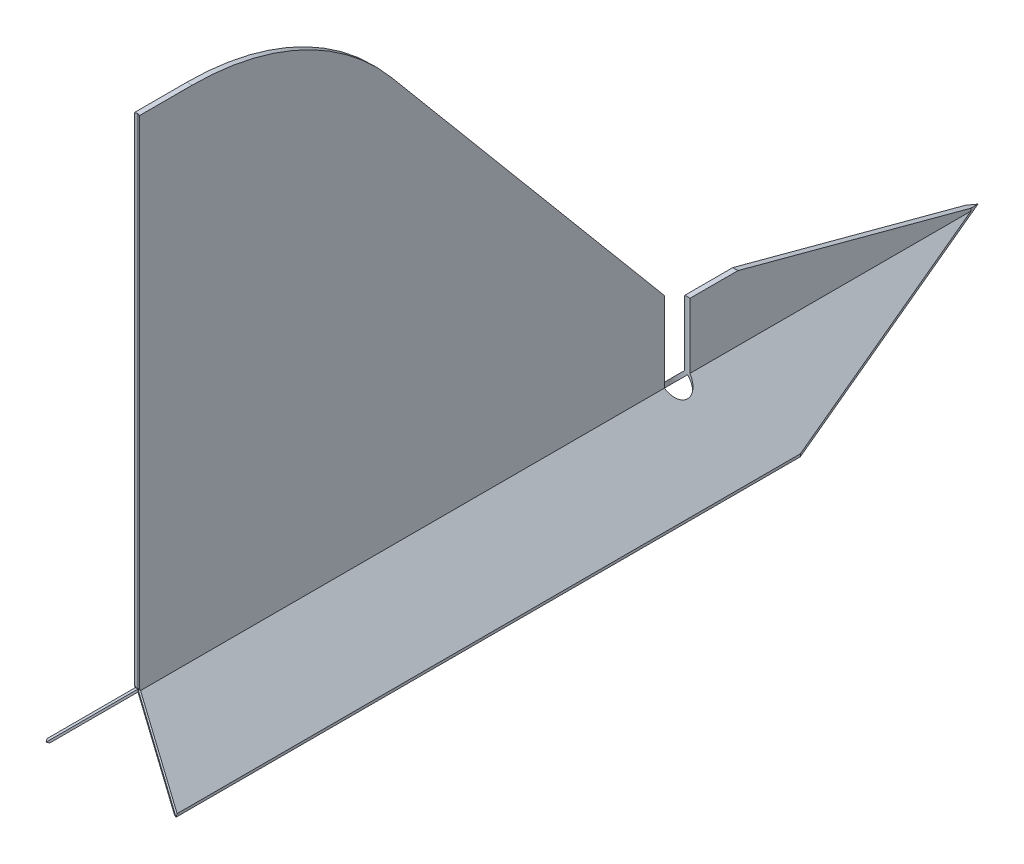
ISO-10303-21;
HEADER;
FILE_DESCRIPTION(('STEP AP214'),'2;1');
FILE_NAME('part.step','',(''),(''),'','','');
FILE_SCHEMA(('AUTOMOTIVE_DESIGN { 1 0 10303 214 1 1 1 1 }'));
ENDSEC;
DATA;
#1=APPLICATION_CONTEXT('core data for automotive mechanical design processes');
#2=APPLICATION_PROTOCOL_DEFINITION('international standard','automotive_design',2000,#1);
#3=PRODUCT_CONTEXT('',#1,'mechanical');
#4=PRODUCT('Part','Part','',(#3));
#5=PRODUCT_RELATED_PRODUCT_CATEGORY('part','',(#4));
#6=PRODUCT_DEFINITION_FORMATION('','',#4);
#7=PRODUCT_DEFINITION_CONTEXT('part definition',#1,'design');
#8=PRODUCT_DEFINITION('design','',#6,#7);
#9=PRODUCT_DEFINITION_SHAPE('','',#8);
#10=(LENGTH_UNIT() NAMED_UNIT(*) SI_UNIT(.MILLI.,.METRE.));
#11=(NAMED_UNIT(*) PLANE_ANGLE_UNIT() SI_UNIT($,.RADIAN.));
#12=(NAMED_UNIT(*) SI_UNIT($,.STERADIAN.) SOLID_ANGLE_UNIT());
#13=UNCERTAINTY_MEASURE_WITH_UNIT(LENGTH_MEASURE(1.E-05),#10,'distance_accuracy_value','');
#14=(GEOMETRIC_REPRESENTATION_CONTEXT(3) GLOBAL_UNCERTAINTY_ASSIGNED_CONTEXT((#13)) GLOBAL_UNIT_ASSIGNED_CONTEXT((#10,
#11,#12)) REPRESENTATION_CONTEXT('',''));
#15=CARTESIAN_POINT('',(0.,0.,0.));
#16=DIRECTION('',(0.,0.,1.));
#17=DIRECTION('',(1.,0.,0.));
#18=AXIS2_PLACEMENT_3D('',#15,#16,#17);
#19=CARTESIAN_POINT('',(313.097459621555,107.5,278.397459621556));
#20=DIRECTION('',(-1.,0.,0.));
#21=DIRECTION('',(0.,0.,1.));
#22=AXIS2_PLACEMENT_3D('',#19,#20,#21);
#23=PLANE('',#22);
#24=DIRECTION('',(0.,0.,1.));
#25=VECTOR('',#24,1.);
#26=CARTESIAN_POINT('',(313.097459621555,50.,278.397459621556));
#27=LINE('',#26,#25);
#28=CARTESIAN_POINT('',(313.097459621555,50.,279.517074863827));
#29=VERTEX_POINT('',#28);
#30=CARTESIAN_POINT('',(313.097459621555,50.,311.927765775887));
#31=VERTEX_POINT('',#30);
#32=EDGE_CURVE('E300',#29,#31,#27,.T.);
#33=ORIENTED_EDGE('',*,*,#32,.T.);
#34=DIRECTION('',(0.,-1.,0.));
#35=VECTOR('',#34,1.);
#36=CARTESIAN_POINT('',(313.097459621555,107.5,311.927765775887));
#37=LINE('',#36,#35);
#38=CARTESIAN_POINT('',(313.097459621555,57.5,311.927765775887));
#39=VERTEX_POINT('',#38);
#40=EDGE_CURVE('E528',#31,#39,#37,.F.);
#41=ORIENTED_EDGE('',*,*,#40,.T.);
#42=DIRECTION('',(0.,0.,1.));
#43=VECTOR('',#42,1.);
#44=CARTESIAN_POINT('',(313.097459621555,57.5,278.397459621556));
#45=LINE('',#44,#43);
#46=CARTESIAN_POINT('',(313.097459621555,57.5,306.387840678323));
#47=VERTEX_POINT('',#46);
#48=EDGE_CURVE('E314',#47,#39,#45,.T.);
#49=ORIENTED_EDGE('',*,*,#48,.F.);
#50=DIRECTION('',(0.,0.258819045102522,0.965925826289068));
#51=VECTOR('',#50,1.);
#52=CARTESIAN_POINT('',(313.097459621555,53.8517696411974,292.772459621556));
#53=LINE('',#52,#51);
#54=CARTESIAN_POINT('',(313.097459621555,50.3,279.517074863827));
#55=VERTEX_POINT('',#54);
#56=EDGE_CURVE('E407',#55,#47,#53,.T.);
#57=ORIENTED_EDGE('',*,*,#56,.F.);
#58=DIRECTION('',(0.,-1.,0.));
#59=VECTOR('',#58,1.);
#60=CARTESIAN_POINT('',(313.097459621555,107.5,279.517074863827));
#61=LINE('',#60,#59);
#62=EDGE_CURVE('E367',#55,#29,#61,.T.);
#63=ORIENTED_EDGE('',*,*,#62,.T.);
#64=EDGE_LOOP('',(#33,#41,#49,#57,#63));
#65=FACE_BOUND('',#64,.T.);
#66=ADVANCED_FACE('F140',(#65),#23,.T.);
#67=DIRECTION('',(0.,0.766044443118981,0.642787609686536));
#68=VECTOR('',#67,1.);
#69=CARTESIAN_POINT('',(313.097459621555,69.6070687639599,323.556496556033));
#70=LINE('',#69,#68);
#71=CARTESIAN_POINT('',(313.097459621555,59.2515129205908,314.867153467226));
#72=VERTEX_POINT('',#71);
#73=CARTESIAN_POINT('',(313.097459621555,96.783628290596,346.360337631501));
#74=VERTEX_POINT('',#73);
#75=EDGE_CURVE('E317',#72,#74,#70,.T.);
#76=ORIENTED_EDGE('',*,*,#75,.F.);
#77=DIRECTION('',(0.,-1.,0.));
#78=VECTOR('',#77,1.);
#79=CARTESIAN_POINT('',(313.097459621555,107.5,314.867153467226));
#80=LINE('',#79,#78);
#81=CARTESIAN_POINT('',(313.097459621555,50.,314.867153467226));
#82=VERTEX_POINT('',#81);
#83=EDGE_CURVE('E469',#72,#82,#80,.T.);
#84=ORIENTED_EDGE('',*,*,#83,.T.);
#85=CARTESIAN_POINT('',(313.097459621555,50.,375.290857903758));
#86=VERTEX_POINT('',#85);
#87=EDGE_CURVE('E304',#82,#86,#27,.T.);
#88=ORIENTED_EDGE('',*,*,#87,.T.);
#89=DIRECTION('',(0.,-0.92387953251128,-0.382683432365106));
#90=VECTOR('',#89,1.);
#91=CARTESIAN_POINT('',(313.097459621555,64.8223304703344,381.430468210547));
#92=LINE('',#91,#90);
#93=CARTESIAN_POINT('',(313.097459621555,50.3000000000002,375.41512197247));
#94=VERTEX_POINT('',#93);
#95=EDGE_CURVE('E376',#94,#86,#92,.T.);
#96=ORIENTED_EDGE('',*,*,#95,.F.);
#97=DIRECTION('',(0.,1.,0.));
#98=VECTOR('',#97,1.);
#99=CARTESIAN_POINT('',(313.097459621555,107.5,375.41512197247));
#100=LINE('',#99,#98);
#101=CARTESIAN_POINT('',(313.097459621555,107.5,375.41512197247));
#102=VERTEX_POINT('',#101);
#103=EDGE_CURVE('E504',#94,#102,#100,.T.);
#104=ORIENTED_EDGE('',*,*,#103,.T.);
#105=DIRECTION('',(0.,0.,1.));
#106=VECTOR('',#105,1.);
#107=CARTESIAN_POINT('',(313.097459621555,107.5,278.397459621556));
#108=LINE('',#107,#106);
#109=CARTESIAN_POINT('',(313.097459621555,107.5,369.34167092507));
#110=VERTEX_POINT('',#109);
#111=EDGE_CURVE('E310',#110,#102,#108,.T.);
#112=ORIENTED_EDGE('',*,*,#111,.F.);
#113=CARTESIAN_POINT('',(313.097459621555,77.5,369.34167092507));
#114=DIRECTION('',(-1.,0.,0.));
#115=DIRECTION('',(0.,0.,1.));
#116=AXIS2_PLACEMENT_3D('',#113,#114,#115);
#117=CIRCLE('',#116,30.);
#118=EDGE_CURVE('E320',#110,#74,#117,.T.);
#119=ORIENTED_EDGE('',*,*,#118,.T.);
#120=EDGE_LOOP('',(#76,#84,#88,#96,#104,#112,#119));
#121=FACE_BOUND('',#120,.T.);
#122=ADVANCED_FACE('F521',(#121),#23,.T.);
#123=CARTESIAN_POINT('',(313.697459621555,50.,278.397459621556));
#124=DIRECTION('',(1.,0.,0.));
#125=DIRECTION('',(0.,0.,-1.));
#126=AXIS2_PLACEMENT_3D('',#123,#124,#125);
#127=PLANE('',#126);
#128=DIRECTION('',(0.,0.,1.));
#129=VECTOR('',#128,1.);
#130=CARTESIAN_POINT('',(313.697459621555,50.,278.397459621556));
#131=LINE('',#130,#129);
#132=CARTESIAN_POINT('',(313.697459621555,50.,314.867153467226));
#133=VERTEX_POINT('',#132);
#134=CARTESIAN_POINT('',(313.697459621555,50.,375.290857903758));
#135=VERTEX_POINT('',#134);
#136=EDGE_CURVE('E302',#133,#135,#131,.T.);
#137=ORIENTED_EDGE('',*,*,#136,.F.);
#138=DIRECTION('',(0.,-1.,0.));
#139=VECTOR('',#138,1.);
#140=CARTESIAN_POINT('',(313.697459621555,107.5,314.867153467226));
#141=LINE('',#140,#139);
#142=CARTESIAN_POINT('',(313.697459621555,59.2515129205908,314.867153467226));
#143=VERTEX_POINT('',#142);
#144=EDGE_CURVE('E470',#133,#143,#141,.F.);
#145=ORIENTED_EDGE('',*,*,#144,.T.);
#146=DIRECTION('',(0.,-0.766044443118981,-0.642787609686536));
#147=VECTOR('',#146,1.);
#148=CARTESIAN_POINT('',(313.697459621555,35.8646836560354,295.243273656932));
#149=LINE('',#148,#147);
#150=CARTESIAN_POINT('',(313.697459621555,96.783628290596,346.360337631501));
#151=VERTEX_POINT('',#150);
#152=EDGE_CURVE('E412',#151,#143,#149,.T.);
#153=ORIENTED_EDGE('',*,*,#152,.F.);
#154=CARTESIAN_POINT('',(313.697459621555,77.5,369.34167092507));
#155=DIRECTION('',(1.,0.,0.));
#156=DIRECTION('',(0.,0.,-1.));
#157=AXIS2_PLACEMENT_3D('',#154,#155,#156);
#158=CIRCLE('',#157,30.);
#159=CARTESIAN_POINT('',(313.697459621555,107.5,369.34167092507));
#160=VERTEX_POINT('',#159);
#161=EDGE_CURVE('E313',#151,#160,#158,.T.);
#162=ORIENTED_EDGE('',*,*,#161,.T.);
#163=DIRECTION('',(0.,0.,1.));
#164=VECTOR('',#163,1.);
#165=CARTESIAN_POINT('',(313.697459621555,107.5,278.397459621556));
#166=LINE('',#165,#164);
#167=CARTESIAN_POINT('',(313.697459621555,107.5,375.41512197247));
#168=VERTEX_POINT('',#167);
#169=EDGE_CURVE('E318',#160,#168,#166,.T.);
#170=ORIENTED_EDGE('',*,*,#169,.T.);
#171=DIRECTION('',(0.,-1.,0.));
#172=VECTOR('',#171,1.);
#173=CARTESIAN_POINT('',(313.697459621555,50.,375.41512197247));
#174=LINE('',#173,#172);
#175=CARTESIAN_POINT('',(313.697459621555,50.3000000000002,375.41512197247));
#176=VERTEX_POINT('',#175);
#177=EDGE_CURVE('E442',#168,#176,#174,.T.);
#178=ORIENTED_EDGE('',*,*,#177,.T.);
#179=DIRECTION('',(0.,0.92387953251128,0.382683432365106));
#180=VECTOR('',#179,1.);
#181=CARTESIAN_POINT('',(313.697459621555,15.7430105112219,361.101148251433));
#182=LINE('',#181,#180);
#183=EDGE_CURVE('E389',#135,#176,#182,.T.);
#184=ORIENTED_EDGE('',*,*,#183,.F.);
#185=EDGE_LOOP('',(#137,#145,#153,#162,#170,#178,#184));
#186=FACE_BOUND('',#185,.T.);
#187=ADVANCED_FACE('F441',(#186),#127,.T.);
#188=DIRECTION('',(0.,0.,-1.));
#189=VECTOR('',#188,1.);
#190=CARTESIAN_POINT('',(313.697459621555,57.5,278.397459621556));
#191=LINE('',#190,#189);
#192=CARTESIAN_POINT('',(313.697459621555,57.5,311.927765775887));
#193=VERTEX_POINT('',#192);
#194=CARTESIAN_POINT('',(313.697459621555,57.5,306.387840678323));
#195=VERTEX_POINT('',#194);
#196=EDGE_CURVE('E410',#193,#195,#191,.T.);
#197=ORIENTED_EDGE('',*,*,#196,.F.);
#198=DIRECTION('',(0.,-1.,0.));
#199=VECTOR('',#198,1.);
#200=CARTESIAN_POINT('',(313.697459621555,107.5,311.927765775887));
#201=LINE('',#200,#199);
#202=CARTESIAN_POINT('',(313.697459621555,50.,311.927765775887));
#203=VERTEX_POINT('',#202);
#204=EDGE_CURVE('E155',#193,#203,#201,.T.);
#205=ORIENTED_EDGE('',*,*,#204,.T.);
#206=CARTESIAN_POINT('',(313.697459621555,50.,279.517074863827));
#207=VERTEX_POINT('',#206);
#208=EDGE_CURVE('E307',#207,#203,#131,.T.);
#209=ORIENTED_EDGE('',*,*,#208,.F.);
#210=DIRECTION('',(0.,1.,0.));
#211=VECTOR('',#210,1.);
#212=CARTESIAN_POINT('',(313.697459621555,50.,279.517074863827));
#213=LINE('',#212,#211);
#214=CARTESIAN_POINT('',(313.697459621555,50.3,279.517074863827));
#215=VERTEX_POINT('',#214);
#216=EDGE_CURVE('E361',#207,#215,#213,.T.);
#217=ORIENTED_EDGE('',*,*,#216,.T.);
#218=DIRECTION('',(0.,-0.258819045102522,-0.965925826289068));
#219=VECTOR('',#218,1.);
#220=CARTESIAN_POINT('',(313.697459621555,50.,278.397459621556));
#221=LINE('',#220,#219);
#222=EDGE_CURVE('E360',#195,#215,#221,.T.);
#223=ORIENTED_EDGE('',*,*,#222,.F.);
#224=EDGE_LOOP('',(#197,#205,#209,#217,#223));
#225=FACE_BOUND('',#224,.T.);
#226=ADVANCED_FACE('F531',(#225),#127,.T.);
#227=CARTESIAN_POINT('',(354.356099539782,9.34136008177326,278.397459621556));
#228=DIRECTION('',(0.70710678118655,0.707106781186545,0.));
#229=DIRECTION('',(-0.707106781186545,0.70710678118655,0.));
#230=AXIS2_PLACEMENT_3D('',#227,#228,#229);
#231=PLANE('',#230);
#232=ORIENTED_EDGE('',*,*,#208,.T.);
#233=CARTESIAN_POINT('',(313.397459621555,50.3,313.397459621556));
#234=DIRECTION('',(0.70710678118655,0.707106781186545,0.));
#235=DIRECTION('',(0.707106781186545,-0.70710678118655,0.));
#236=AXIS2_PLACEMENT_3D('',#233,#234,#235);
#237=ELLIPSE('',#236,2.12132034355969,1.50000000000002);
#238=EDGE_CURVE('E428',#203,#133,#237,.F.);
#239=ORIENTED_EDGE('',*,*,#238,.T.);
#240=ORIENTED_EDGE('',*,*,#136,.T.);
#241=DIRECTION('',(-0.678598344545842,0.678598344545847,-0.281084637714833));
#242=VECTOR('',#241,1.);
#243=CARTESIAN_POINT('',(332.661925715621,31.0355339059336,383.146196963086));
#244=LINE('',#243,#242);
#245=CARTESIAN_POINT('',(320.897459621555,42.7999999999999,378.273195552845));
#246=VERTEX_POINT('',#245);
#247=EDGE_CURVE('E395',#246,#135,#244,.T.);
#248=ORIENTED_EDGE('',*,*,#247,.F.);
#249=DIRECTION('',(0.,0.,-1.));
#250=VECTOR('',#249,1.);
#251=CARTESIAN_POINT('',(320.897459621555,42.8,278.397459621556));
#252=LINE('',#251,#250);
#253=CARTESIAN_POINT('',(320.897459621555,42.8,306.387840678324));
#254=VERTEX_POINT('',#253);
#255=EDGE_CURVE('E450',#246,#254,#252,.T.);
#256=ORIENTED_EDGE('',*,*,#255,.T.);
#257=DIRECTION('',(-0.250562807085727,0.250562807085729,-0.935113126531032));
#258=VECTOR('',#257,1.);
#259=CARTESIAN_POINT('',(318.540367371548,45.1570922500068,297.591052643171));
#260=LINE('',#259,#258);
#261=EDGE_CURVE('E364',#254,#207,#260,.T.);
#262=ORIENTED_EDGE('',*,*,#261,.T.);
#263=EDGE_LOOP('',(#232,#239,#240,#248,#256,#262));
#264=FACE_BOUND('',#263,.T.);
#265=ADVANCED_FACE('F426',(#264),#231,.T.);
#266=CARTESIAN_POINT('',(272.438819703329,9.34136008177345,278.397459621556));
#267=DIRECTION('',(-0.707106781186549,0.707106781186546,0.));
#268=DIRECTION('',(-0.707106781186546,-0.707106781186549,0.));
#269=AXIS2_PLACEMENT_3D('',#266,#267,#268);
#270=PLANE('',#269);
#271=ORIENTED_EDGE('',*,*,#87,.F.);
#272=CARTESIAN_POINT('',(313.397459621555,50.3,313.397459621556));
#273=DIRECTION('',(-0.707106781186549,0.707106781186546,0.));
#274=DIRECTION('',(-0.707106781186546,-0.707106781186549,0.));
#275=AXIS2_PLACEMENT_3D('',#272,#273,#274);
#276=ELLIPSE('',#275,2.12132034355968,1.50000000000002);
#277=EDGE_CURVE('E466',#82,#31,#276,.F.);
#278=ORIENTED_EDGE('',*,*,#277,.T.);
#279=ORIENTED_EDGE('',*,*,#32,.F.);
#280=DIRECTION('',(-0.250562807085727,-0.250562807085728,0.935113126531032));
#281=VECTOR('',#280,1.);
#282=CARTESIAN_POINT('',(308.254551871562,45.1570922500068,297.591052643171));
#283=LINE('',#282,#281);
#284=CARTESIAN_POINT('',(305.897459621555,42.8,306.387840678324));
#285=VERTEX_POINT('',#284);
#286=EDGE_CURVE('E362',#29,#285,#283,.T.);
#287=ORIENTED_EDGE('',*,*,#286,.T.);
#288=DIRECTION('',(0.,0.,1.));
#289=VECTOR('',#288,1.);
#290=CARTESIAN_POINT('',(305.897459621555,42.8,278.397459621556));
#291=LINE('',#290,#289);
#292=CARTESIAN_POINT('',(305.897459621555,42.7999999999999,378.273195552845));
#293=VERTEX_POINT('',#292);
#294=EDGE_CURVE('E446',#285,#293,#291,.T.);
#295=ORIENTED_EDGE('',*,*,#294,.T.);
#296=DIRECTION('',(-0.678598344545843,-0.678598344545846,0.281084637714832));
#297=VECTOR('',#296,1.);
#298=CARTESIAN_POINT('',(294.132993527489,31.0355339059337,383.146196963086));
#299=LINE('',#298,#297);
#300=EDGE_CURVE('E392',#86,#293,#299,.T.);
#301=ORIENTED_EDGE('',*,*,#300,.F.);
#302=EDGE_LOOP('',(#271,#278,#279,#287,#295,#301));
#303=FACE_BOUND('',#302,.T.);
#304=ADVANCED_FACE('F465',(#303),#270,.T.);
#305=CARTESIAN_POINT('',(313.697459621555,107.5,278.397459621556));
#306=DIRECTION('',(0.,1.,0.));
#307=DIRECTION('',(0.,0.,1.));
#308=AXIS2_PLACEMENT_3D('',#305,#306,#307);
#309=PLANE('',#308);
#310=DIRECTION('',(0.923879532511285,0.,-0.382683432365094));
#311=VECTOR('',#310,1.);
#312=CARTESIAN_POINT('',(305.897459621555,107.5,378.397459621556));
#313=LINE('',#312,#311);
#314=CARTESIAN_POINT('',(313.397459621555,107.5,375.290857903758));
#315=VERTEX_POINT('',#314);
#316=EDGE_CURVE('E478',#102,#315,#313,.T.);
#317=ORIENTED_EDGE('',*,*,#316,.T.);
#318=DIRECTION('',(0.923879532511285,0.,0.382683432365094));
#319=VECTOR('',#318,1.);
#320=CARTESIAN_POINT('',(313.397459621555,107.5,375.290857903758));
#321=LINE('',#320,#319);
#322=EDGE_CURVE('E481',#315,#168,#321,.T.);
#323=ORIENTED_EDGE('',*,*,#322,.T.);
#324=ORIENTED_EDGE('',*,*,#169,.F.);
#325=DIRECTION('',(1.,0.,0.));
#326=VECTOR('',#325,1.);
#327=CARTESIAN_POINT('',(272.438819703329,107.5,369.34167092507));
#328=LINE('',#327,#326);
#329=EDGE_CURVE('E374',#110,#160,#328,.T.);
#330=ORIENTED_EDGE('',*,*,#329,.F.);
#331=ORIENTED_EDGE('',*,*,#111,.T.);
#332=EDGE_LOOP('',(#317,#323,#324,#330,#331));
#333=FACE_BOUND('',#332,.T.);
#334=ADVANCED_FACE('F142',(#333),#309,.T.);
#335=CARTESIAN_POINT('',(272.438819703329,-22.9487298107784,6.14909362011811));
#336=DIRECTION('',(0.,-0.965925826289068,0.258819045102521));
#337=DIRECTION('',(0.,-0.258819045102522,-0.965925826289068));
#338=AXIS2_PLACEMENT_3D('',#335,#336,#337);
#339=PLANE('',#338);
#340=DIRECTION('',(0.250562807085726,0.250562807085733,0.93511312653103));
#341=VECTOR('',#340,1.);
#342=CARTESIAN_POINT('',(242.457122686614,-20.9403369349426,13.6445178742966));
#343=LINE('',#342,#341);
#344=CARTESIAN_POINT('',(313.397459621555,50.,278.397459621556));
#345=VERTEX_POINT('',#344);
#346=EDGE_CURVE('E337',#345,#215,#343,.T.);
#347=ORIENTED_EDGE('',*,*,#346,.F.);
#348=DIRECTION('',(0.250562807085726,-0.250562807085733,-0.93511312653103));
#349=VECTOR('',#348,1.);
#350=CARTESIAN_POINT('',(379.194888806503,-15.7974291849493,32.838110895911));
#351=LINE('',#350,#349);
#352=EDGE_CURVE('E356',#55,#345,#351,.T.);
#353=ORIENTED_EDGE('',*,*,#352,.F.);
#354=ORIENTED_EDGE('',*,*,#56,.T.);
#355=DIRECTION('',(1.,0.,0.));
#356=VECTOR('',#355,1.);
#357=CARTESIAN_POINT('',(272.438819703329,57.5,306.387840678323));
#358=LINE('',#357,#356);
#359=EDGE_CURVE('E380',#47,#195,#358,.T.);
#360=ORIENTED_EDGE('',*,*,#359,.T.);
#361=ORIENTED_EDGE('',*,*,#222,.T.);
#362=EDGE_LOOP('',(#347,#353,#354,#360,#361));
#363=FACE_BOUND('',#362,.T.);
#364=ADVANCED_FACE('F355',(#363),#339,.F.);
#365=CARTESIAN_POINT('',(272.438819703329,140.007685740873,338.008453752071));
#366=DIRECTION('',(0.,-0.382683432365104,-0.923879532511281));
#367=DIRECTION('',(0.,0.923879532511281,-0.382683432365104));
#368=AXIS2_PLACEMENT_3D('',#365,#366,#367);
#369=PLANE('',#368);
#370=DIRECTION('',(0.,-0.923879532511281,0.382683432365104));
#371=VECTOR('',#370,1.);
#372=CARTESIAN_POINT('',(320.897459621555,140.007685740873,338.008453752071));
#373=LINE('',#372,#371);
#374=CARTESIAN_POINT('',(320.897459621555,42.5,378.397459621556));
#375=VERTEX_POINT('',#374);
#376=EDGE_CURVE('E328',#246,#375,#373,.T.);
#377=ORIENTED_EDGE('',*,*,#376,.F.);
#378=ORIENTED_EDGE('',*,*,#247,.T.);
#379=DIRECTION('',(1.,0.,0.));
#380=VECTOR('',#379,1.);
#381=CARTESIAN_POINT('',(272.438819703329,50.,375.290857903758));
#382=LINE('',#381,#380);
#383=CARTESIAN_POINT('',(313.397459621555,50.0000000000002,375.290857903758));
#384=VERTEX_POINT('',#383);
#385=EDGE_CURVE('E373',#384,#135,#382,.T.);
#386=ORIENTED_EDGE('',*,*,#385,.F.);
#387=DIRECTION('',(-0.678598344545857,0.678598344545834,-0.281084637714828));
#388=VECTOR('',#387,1.);
#389=CARTESIAN_POINT('',(245.976649219559,117.420810401994,347.364243849066));
#390=LINE('',#389,#388);
#391=EDGE_CURVE('E447',#375,#384,#390,.T.);
#392=ORIENTED_EDGE('',*,*,#391,.F.);
#393=EDGE_LOOP('',(#377,#378,#386,#392));
#394=FACE_BOUND('',#393,.T.);
#395=ADVANCED_FACE('F435',(#394),#369,.F.);
#396=DIRECTION('',(-0.678598344545857,-0.678598344545834,0.281084637714828));
#397=VECTOR('',#396,1.);
#398=CARTESIAN_POINT('',(343.095713820191,79.6982541986345,362.98943823588));
#399=LINE('',#398,#397);
#400=CARTESIAN_POINT('',(305.897459621555,42.5,378.397459621556));
#401=VERTEX_POINT('',#400);
#402=EDGE_CURVE('E502',#384,#401,#399,.T.);
#403=ORIENTED_EDGE('',*,*,#402,.F.);
#404=EDGE_CURVE('E384',#86,#384,#382,.T.);
#405=ORIENTED_EDGE('',*,*,#404,.F.);
#406=ORIENTED_EDGE('',*,*,#300,.T.);
#407=DIRECTION('',(0.,0.923879532511281,-0.382683432365104));
#408=VECTOR('',#407,1.);
#409=CARTESIAN_POINT('',(305.897459621555,140.007685740873,338.008453752071));
#410=LINE('',#409,#408);
#411=EDGE_CURVE('E326',#401,#293,#410,.T.);
#412=ORIENTED_EDGE('',*,*,#411,.F.);
#413=EDGE_LOOP('',(#403,#405,#406,#412));
#414=FACE_BOUND('',#413,.T.);
#415=ADVANCED_FACE('F513',(#414),#369,.F.);
#416=CARTESIAN_POINT('',(272.438819703329,-125.3630248002,302.653114692742));
#417=DIRECTION('',(0.,0.382683432365106,-0.92387953251128));
#418=DIRECTION('',(0.,0.92387953251128,0.382683432365106));
#419=AXIS2_PLACEMENT_3D('',#416,#417,#418);
#420=PLANE('',#419);
#421=DIRECTION('',(0.678598344545859,0.678598344545832,0.281084637714828));
#422=VECTOR('',#421,1.);
#423=CARTESIAN_POINT('',(199.927077897522,-63.4703817240283,328.289886866011));
#424=LINE('',#423,#422);
#425=EDGE_CURVE('E440',#384,#176,#424,.T.);
#426=ORIENTED_EDGE('',*,*,#425,.F.);
#427=ORIENTED_EDGE('',*,*,#385,.T.);
#428=ORIENTED_EDGE('',*,*,#183,.T.);
#429=EDGE_LOOP('',(#426,#427,#428));
#430=FACE_BOUND('',#429,.T.);
#431=ADVANCED_FACE('F439',(#430),#420,.F.);
#432=DIRECTION('',(0.678598344545859,-0.678598344545832,-0.281084637714828));
#433=VECTOR('',#432,1.);
#434=CARTESIAN_POINT('',(389.145285142227,-25.747825520669,343.915081252825));
#435=LINE('',#434,#433);
#436=EDGE_CURVE('E495',#94,#384,#435,.T.);
#437=ORIENTED_EDGE('',*,*,#436,.F.);
#438=ORIENTED_EDGE('',*,*,#95,.T.);
#439=ORIENTED_EDGE('',*,*,#404,.T.);
#440=EDGE_LOOP('',(#437,#438,#439));
#441=FACE_BOUND('',#440,.T.);
#442=ADVANCED_FACE('F517',(#441),#420,.F.);
#443=CARTESIAN_POINT('',(272.438819703329,77.5,369.34167092507));
#444=DIRECTION('',(1.,0.,0.));
#445=DIRECTION('',(0.,0.,-1.));
#446=AXIS2_PLACEMENT_3D('',#443,#444,#445);
#447=CYLINDRICAL_SURFACE('',#446,30.);
#448=DIRECTION('',(1.,0.,0.));
#449=VECTOR('',#448,1.);
#450=CARTESIAN_POINT('',(272.438819703329,96.783628290596,346.360337631501));
#451=LINE('',#450,#449);
#452=EDGE_CURVE('E377',#74,#151,#451,.T.);
#453=ORIENTED_EDGE('',*,*,#452,.F.);
#454=ORIENTED_EDGE('',*,*,#118,.F.);
#455=ORIENTED_EDGE('',*,*,#329,.T.);
#456=ORIENTED_EDGE('',*,*,#161,.F.);
#457=EDGE_LOOP('',(#453,#454,#455,#456));
#458=FACE_BOUND('',#457,.T.);
#459=ADVANCED_FACE('F551',(#458),#447,.T.);
#460=CARTESIAN_POINT('',(272.438819703329,-130.560509112744,155.595955786043));
#461=DIRECTION('',(0.,-0.642787609686536,0.766044443118981));
#462=DIRECTION('',(0.,-0.766044443118981,-0.642787609686536));
#463=AXIS2_PLACEMENT_3D('',#460,#461,#462);
#464=PLANE('',#463);
#465=CARTESIAN_POINT('',(313.397459621555,57.5000000000001,313.397459621556));
#466=DIRECTION('',(0.,-0.642787609686536,0.766044443118981));
#467=DIRECTION('',(0.,-0.766044443118981,-0.642787609686536));
#468=AXIS2_PLACEMENT_3D('',#465,#466,#467);
#469=ELLIPSE('',#468,2.33358574029067,1.50000000000002);
#470=EDGE_CURVE('E472',#72,#143,#469,.F.);
#471=ORIENTED_EDGE('',*,*,#470,.F.);
#472=ORIENTED_EDGE('',*,*,#75,.T.);
#473=ORIENTED_EDGE('',*,*,#452,.T.);
#474=ORIENTED_EDGE('',*,*,#152,.T.);
#475=EDGE_LOOP('',(#471,#472,#473,#474));
#476=FACE_BOUND('',#475,.T.);
#477=ADVANCED_FACE('F525',(#476),#464,.F.);
#478=CARTESIAN_POINT('',(272.438819703329,57.5,0.));
#479=DIRECTION('',(0.,-1.,0.));
#480=DIRECTION('',(0.,0.,-1.));
#481=AXIS2_PLACEMENT_3D('',#478,#479,#480);
#482=PLANE('',#481);
#483=CARTESIAN_POINT('',(313.397459621555,57.5,313.397459621556));
#484=DIRECTION('',(0.,-1.,0.));
#485=DIRECTION('',(0.,0.,-1.));
#486=AXIS2_PLACEMENT_3D('',#483,#484,#485);
#487=CIRCLE('',#486,1.50000000000002);
#488=EDGE_CURVE('E294',#193,#39,#487,.F.);
#489=ORIENTED_EDGE('',*,*,#488,.F.);
#490=ORIENTED_EDGE('',*,*,#196,.T.);
#491=ORIENTED_EDGE('',*,*,#359,.F.);
#492=ORIENTED_EDGE('',*,*,#48,.T.);
#493=EDGE_LOOP('',(#489,#490,#491,#492));
#494=FACE_BOUND('',#493,.T.);
#495=ADVANCED_FACE('F537',(#494),#482,.F.);
#496=CARTESIAN_POINT('',(305.897459621555,42.5,378.397459621556));
#497=DIRECTION('',(0.382683432365094,0.,0.923879532511285));
#498=DIRECTION('',(0.923879532511285,0.,-0.382683432365094));
#499=AXIS2_PLACEMENT_3D('',#496,#497,#498);
#500=PLANE('',#499);
#501=ORIENTED_EDGE('',*,*,#402,.T.);
#502=DIRECTION('',(0.923879532511285,0.,-0.382683432365094));
#503=VECTOR('',#502,1.);
#504=CARTESIAN_POINT('',(305.897459621555,42.5,378.397459621556));
#505=LINE('',#504,#503);
#506=CARTESIAN_POINT('',(306.197459621555,42.5,378.273195552844));
#507=VERTEX_POINT('',#506);
#508=EDGE_CURVE('E486',#401,#507,#505,.T.);
#509=ORIENTED_EDGE('',*,*,#508,.T.);
#510=DIRECTION('',(-0.678598344545849,-0.678598344545844,0.281084637714824));
#511=VECTOR('',#510,1.);
#512=CARTESIAN_POINT('',(331.879252302916,68.18179268136,367.635448718171));
#513=LINE('',#512,#511);
#514=CARTESIAN_POINT('',(313.397459621555,49.6999999999996,375.290857903758));
#515=VERTEX_POINT('',#514);
#516=EDGE_CURVE('E323',#515,#507,#513,.T.);
#517=ORIENTED_EDGE('',*,*,#516,.F.);
#518=DIRECTION('',(0.,1.,0.));
#519=VECTOR('',#518,1.);
#520=CARTESIAN_POINT('',(313.397459621555,42.5,375.290857903758));
#521=LINE('',#520,#519);
#522=EDGE_CURVE('E496',#515,#384,#521,.T.);
#523=ORIENTED_EDGE('',*,*,#522,.T.);
#524=EDGE_LOOP('',(#501,#509,#517,#523));
#525=FACE_BOUND('',#524,.T.);
#526=ADVANCED_FACE('F587',(#525),#500,.T.);
#527=CARTESIAN_POINT('',(313.397459621555,42.5,375.290857903758));
#528=DIRECTION('',(-0.382683432365094,0.,0.923879532511285));
#529=DIRECTION('',(0.923879532511285,0.,0.382683432365094));
#530=AXIS2_PLACEMENT_3D('',#527,#528,#529);
#531=PLANE('',#530);
#532=ORIENTED_EDGE('',*,*,#391,.T.);
#533=ORIENTED_EDGE('',*,*,#522,.F.);
#534=DIRECTION('',(-0.678598344545845,0.678598344545848,-0.281084637714823));
#535=VECTOR('',#534,1.);
#536=CARTESIAN_POINT('',(332.361925715622,30.7355339059328,383.146196963086));
#537=LINE('',#536,#535);
#538=CARTESIAN_POINT('',(320.597459621555,42.5,378.273195552845));
#539=VERTEX_POINT('',#538);
#540=EDGE_CURVE('E299',#539,#515,#537,.T.);
#541=ORIENTED_EDGE('',*,*,#540,.F.);
#542=DIRECTION('',(0.923879532511285,0.,0.382683432365094));
#543=VECTOR('',#542,1.);
#544=CARTESIAN_POINT('',(313.397459621555,42.5,375.290857903758));
#545=LINE('',#544,#543);
#546=EDGE_CURVE('E488',#539,#375,#545,.T.);
#547=ORIENTED_EDGE('',*,*,#546,.T.);
#548=EDGE_LOOP('',(#532,#533,#541,#547));
#549=FACE_BOUND('',#548,.T.);
#550=ADVANCED_FACE('F546',(#549),#531,.T.);
#551=ORIENTED_EDGE('',*,*,#436,.T.);
#552=EDGE_CURVE('E497',#384,#315,#521,.T.);
#553=ORIENTED_EDGE('',*,*,#552,.T.);
#554=ORIENTED_EDGE('',*,*,#316,.F.);
#555=ORIENTED_EDGE('',*,*,#103,.F.);
#556=EDGE_LOOP('',(#551,#553,#554,#555));
#557=FACE_BOUND('',#556,.T.);
#558=ADVANCED_FACE('F547',(#557),#500,.T.);
#559=ORIENTED_EDGE('',*,*,#322,.F.);
#560=ORIENTED_EDGE('',*,*,#552,.F.);
#561=ORIENTED_EDGE('',*,*,#425,.T.);
#562=ORIENTED_EDGE('',*,*,#177,.F.);
#563=EDGE_LOOP('',(#559,#560,#561,#562));
#564=FACE_BOUND('',#563,.T.);
#565=ADVANCED_FACE('F507',(#564),#531,.T.);
#566=CARTESIAN_POINT('',(305.897459621555,42.5,306.387840678324));
#567=DIRECTION('',(-1.,0.,0.));
#568=DIRECTION('',(0.,0.,1.));
#569=AXIS2_PLACEMENT_3D('',#566,#567,#568);
#570=PLANE('',#569);
#571=DIRECTION('',(0.,1.,0.));
#572=VECTOR('',#571,1.);
#573=CARTESIAN_POINT('',(305.897459621555,42.5,306.387840678324));
#574=LINE('',#573,#572);
#575=CARTESIAN_POINT('',(305.897459621555,42.5,306.387840678324));
#576=VERTEX_POINT('',#575);
#577=EDGE_CURVE('E493',#576,#285,#574,.T.);
#578=ORIENTED_EDGE('',*,*,#577,.F.);
#579=DIRECTION('',(0.,0.,1.));
#580=VECTOR('',#579,1.);
#581=CARTESIAN_POINT('',(305.897459621555,42.5,306.387840678324));
#582=LINE('',#581,#580);
#583=EDGE_CURVE('E483',#576,#401,#582,.T.);
#584=ORIENTED_EDGE('',*,*,#583,.T.);
#585=ORIENTED_EDGE('',*,*,#411,.T.);
#586=ORIENTED_EDGE('',*,*,#294,.F.);
#587=EDGE_LOOP('',(#578,#584,#585,#586));
#588=FACE_BOUND('',#587,.T.);
#589=ADVANCED_FACE('F601',(#588),#570,.T.);
#590=CARTESIAN_POINT('',(313.397459621555,42.5,278.397459621556));
#591=DIRECTION('',(-0.96592582628907,0.,-0.258819045102516));
#592=DIRECTION('',(-0.258819045102516,0.,0.96592582628907));
#593=AXIS2_PLACEMENT_3D('',#590,#591,#592);
#594=PLANE('',#593);
#595=ORIENTED_EDGE('',*,*,#62,.F.);
#596=ORIENTED_EDGE('',*,*,#352,.T.);
#597=DIRECTION('',(-0.250562807085726,-0.250562807085732,0.935113126531031));
#598=VECTOR('',#597,1.);
#599=CARTESIAN_POINT('',(372.916716777035,109.519257155481,56.268567888544));
#600=LINE('',#599,#598);
#601=EDGE_CURVE('E330',#345,#576,#600,.T.);
#602=ORIENTED_EDGE('',*,*,#601,.T.);
#603=ORIENTED_EDGE('',*,*,#577,.T.);
#604=ORIENTED_EDGE('',*,*,#286,.F.);
#605=EDGE_LOOP('',(#595,#596,#602,#603,#604));
#606=FACE_BOUND('',#605,.T.);
#607=ADVANCED_FACE('F605',(#606),#594,.T.);
#608=CARTESIAN_POINT('',(320.897459621555,42.5,306.387840678324));
#609=DIRECTION('',(0.96592582628907,0.,-0.258819045102516));
#610=DIRECTION('',(-0.258819045102516,0.,-0.96592582628907));
#611=AXIS2_PLACEMENT_3D('',#608,#609,#610);
#612=PLANE('',#611);
#613=DIRECTION('',(0.,1.,0.));
#614=VECTOR('',#613,1.);
#615=CARTESIAN_POINT('',(320.897459621555,42.5,306.387840678324));
#616=LINE('',#615,#614);
#617=CARTESIAN_POINT('',(320.897459621555,42.5,306.387840678324));
#618=VERTEX_POINT('',#617);
#619=EDGE_CURVE('E340',#618,#254,#616,.T.);
#620=ORIENTED_EDGE('',*,*,#619,.F.);
#621=DIRECTION('',(-0.250562807085726,0.250562807085732,-0.935113126531031));
#622=VECTOR('',#621,1.);
#623=CARTESIAN_POINT('',(248.735294716082,114.662164905474,37.0749748669295));
#624=LINE('',#623,#622);
#625=EDGE_CURVE('E148',#618,#345,#624,.T.);
#626=ORIENTED_EDGE('',*,*,#625,.T.);
#627=ORIENTED_EDGE('',*,*,#346,.T.);
#628=ORIENTED_EDGE('',*,*,#216,.F.);
#629=ORIENTED_EDGE('',*,*,#261,.F.);
#630=EDGE_LOOP('',(#620,#626,#627,#628,#629));
#631=FACE_BOUND('',#630,.T.);
#632=ADVANCED_FACE('F335',(#631),#612,.T.);
#633=CARTESIAN_POINT('',(320.897459621555,42.5,378.397459621556));
#634=DIRECTION('',(1.,0.,0.));
#635=DIRECTION('',(0.,0.,-1.));
#636=AXIS2_PLACEMENT_3D('',#633,#634,#635);
#637=PLANE('',#636);
#638=ORIENTED_EDGE('',*,*,#376,.T.);
#639=DIRECTION('',(0.,0.,-1.));
#640=VECTOR('',#639,1.);
#641=CARTESIAN_POINT('',(320.897459621555,42.5,378.397459621556));
#642=LINE('',#641,#640);
#643=EDGE_CURVE('E491',#375,#618,#642,.T.);
#644=ORIENTED_EDGE('',*,*,#643,.T.);
#645=ORIENTED_EDGE('',*,*,#619,.T.);
#646=ORIENTED_EDGE('',*,*,#255,.F.);
#647=EDGE_LOOP('',(#638,#644,#645,#646));
#648=FACE_BOUND('',#647,.T.);
#649=ADVANCED_FACE('F539',(#648),#637,.T.);
#650=CARTESIAN_POINT('',(313.397459621555,49.6999999999998,278.397459621556));
#651=DIRECTION('',(0.707106781186545,-0.70710678118655,0.));
#652=DIRECTION('',(0.70710678118655,0.707106781186545,0.));
#653=AXIS2_PLACEMENT_3D('',#650,#651,#652);
#654=PLANE('',#653);
#655=DIRECTION('',(0.,0.,1.));
#656=VECTOR('',#655,1.);
#657=CARTESIAN_POINT('',(313.397459621555,49.6999999999998,278.397459621556));
#658=LINE('',#657,#656);
#659=CARTESIAN_POINT('',(313.397459621555,49.6999999999997,279.517074863828));
#660=VERTEX_POINT('',#659);
#661=CARTESIAN_POINT('',(313.397459621555,49.6999999999998,311.897459621556));
#662=VERTEX_POINT('',#661);
#663=EDGE_CURVE('E293',#660,#662,#658,.T.);
#664=ORIENTED_EDGE('',*,*,#663,.T.);
#665=CARTESIAN_POINT('',(313.397459621555,49.6999999999996,313.397459621556));
#666=DIRECTION('',(0.707106781186545,-0.70710678118655,0.));
#667=DIRECTION('',(-0.70710678118655,-0.707106781186545,0.));
#668=AXIS2_PLACEMENT_3D('',#665,#666,#667);
#669=ELLIPSE('',#668,2.12132034355967,1.50000000000002);
#670=CARTESIAN_POINT('',(313.397459621555,49.6999999999998,314.897459621556));
#671=VERTEX_POINT('',#670);
#672=EDGE_CURVE('E162',#662,#671,#669,.F.);
#673=ORIENTED_EDGE('',*,*,#672,.T.);
#674=EDGE_CURVE('E290',#671,#515,#658,.T.);
#675=ORIENTED_EDGE('',*,*,#674,.T.);
#676=ORIENTED_EDGE('',*,*,#516,.T.);
#677=DIRECTION('',(0.,0.,1.));
#678=VECTOR('',#677,1.);
#679=CARTESIAN_POINT('',(306.197459621555,42.5,278.397459621556));
#680=LINE('',#679,#678);
#681=CARTESIAN_POINT('',(306.197459621555,42.5,306.387840678323));
#682=VERTEX_POINT('',#681);
#683=EDGE_CURVE('E398',#682,#507,#680,.T.);
#684=ORIENTED_EDGE('',*,*,#683,.F.);
#685=DIRECTION('',(-0.250562807085733,-0.250562807085732,0.935113126531029));
#686=VECTOR('',#685,1.);
#687=CARTESIAN_POINT('',(313.659790589379,49.9623309678232,278.538042363512));
#688=LINE('',#687,#686);
#689=EDGE_CURVE('E403',#660,#682,#688,.T.);
#690=ORIENTED_EDGE('',*,*,#689,.F.);
#691=EDGE_LOOP('',(#664,#673,#675,#676,#684,#690));
#692=FACE_BOUND('',#691,.T.);
#693=ADVANCED_FACE('F288',(#692),#654,.T.);
#694=CARTESIAN_POINT('',(354.056099539781,9.04136008177339,278.397459621556));
#695=DIRECTION('',(-0.707106781186549,-0.707106781186546,0.));
#696=DIRECTION('',(0.707106781186546,-0.707106781186549,0.));
#697=AXIS2_PLACEMENT_3D('',#694,#695,#696);
#698=PLANE('',#697);
#699=ORIENTED_EDGE('',*,*,#674,.F.);
#700=CARTESIAN_POINT('',(313.397459621555,49.6999999999999,313.397459621556));
#701=DIRECTION('',(-0.707106781186549,-0.707106781186546,0.));
#702=DIRECTION('',(0.707106781186546,-0.707106781186549,0.));
#703=AXIS2_PLACEMENT_3D('',#700,#701,#702);
#704=ELLIPSE('',#703,2.12132034355968,1.50000000000002);
#705=EDGE_CURVE('E13',#671,#662,#704,.F.);
#706=ORIENTED_EDGE('',*,*,#705,.T.);
#707=ORIENTED_EDGE('',*,*,#663,.F.);
#708=DIRECTION('',(-0.25056280708573,0.250562807085732,-0.93511312653103));
#709=VECTOR('',#708,1.);
#710=CARTESIAN_POINT('',(318.240367371548,44.8570922500067,297.591052643171));
#711=LINE('',#710,#709);
#712=CARTESIAN_POINT('',(320.597459621555,42.5,306.387840678323));
#713=VERTEX_POINT('',#712);
#714=EDGE_CURVE('E405',#713,#660,#711,.T.);
#715=ORIENTED_EDGE('',*,*,#714,.F.);
#716=DIRECTION('',(0.,0.,-1.));
#717=VECTOR('',#716,1.);
#718=CARTESIAN_POINT('',(320.597459621555,42.5,278.397459621556));
#719=LINE('',#718,#717);
#720=EDGE_CURVE('E401',#539,#713,#719,.T.);
#721=ORIENTED_EDGE('',*,*,#720,.F.);
#722=ORIENTED_EDGE('',*,*,#540,.T.);
#723=EDGE_LOOP('',(#699,#706,#707,#715,#721,#722));
#724=FACE_BOUND('',#723,.T.);
#725=ADVANCED_FACE('F297',(#724),#698,.T.);
#726=CARTESIAN_POINT('',(272.438819703329,42.5,0.));
#727=DIRECTION('',(0.,1.,0.));
#728=DIRECTION('',(0.,0.,1.));
#729=AXIS2_PLACEMENT_3D('',#726,#727,#728);
#730=PLANE('',#729);
#731=ORIENTED_EDGE('',*,*,#508,.F.);
#732=ORIENTED_EDGE('',*,*,#583,.F.);
#733=DIRECTION('',(1.,0.,0.));
#734=VECTOR('',#733,1.);
#735=CARTESIAN_POINT('',(272.438819703329,42.5,306.387840678323));
#736=LINE('',#735,#734);
#737=EDGE_CURVE('E348',#576,#682,#736,.T.);
#738=ORIENTED_EDGE('',*,*,#737,.T.);
#739=ORIENTED_EDGE('',*,*,#683,.T.);
#740=EDGE_LOOP('',(#731,#732,#738,#739));
#741=FACE_BOUND('',#740,.T.);
#742=ADVANCED_FACE('F572',(#741),#730,.F.);
#743=CARTESIAN_POINT('',(272.438819703329,116.25,31.1490936201181));
#744=DIRECTION('',(0.,0.965925826289068,0.258819045102521));
#745=DIRECTION('',(0.,-0.258819045102521,0.965925826289068));
#746=AXIS2_PLACEMENT_3D('',#743,#744,#745);
#747=PLANE('',#746);
#748=ORIENTED_EDGE('',*,*,#625,.F.);
#749=EDGE_CURVE('E382',#713,#618,#736,.T.);
#750=ORIENTED_EDGE('',*,*,#749,.F.);
#751=ORIENTED_EDGE('',*,*,#714,.T.);
#752=ORIENTED_EDGE('',*,*,#689,.T.);
#753=ORIENTED_EDGE('',*,*,#737,.F.);
#754=ORIENTED_EDGE('',*,*,#601,.F.);
#755=EDGE_LOOP('',(#748,#750,#751,#752,#753,#754));
#756=FACE_BOUND('',#755,.T.);
#757=ADVANCED_FACE('F346',(#756),#747,.F.);
#758=ORIENTED_EDGE('',*,*,#643,.F.);
#759=ORIENTED_EDGE('',*,*,#546,.F.);
#760=ORIENTED_EDGE('',*,*,#720,.T.);
#761=ORIENTED_EDGE('',*,*,#749,.T.);
#762=EDGE_LOOP('',(#758,#759,#760,#761));
#763=FACE_BOUND('',#762,.T.);
#764=ADVANCED_FACE('F543',(#763),#730,.F.);
#765=CARTESIAN_POINT('',(313.397459621555,107.5,313.397459621556));
#766=DIRECTION('',(0.,-1.,0.));
#767=DIRECTION('',(0.,0.,-1.));
#768=AXIS2_PLACEMENT_3D('',#765,#766,#767);
#769=CYLINDRICAL_SURFACE('',#768,1.50000000000002);
#770=ORIENTED_EDGE('',*,*,#705,.F.);
#771=ORIENTED_EDGE('',*,*,#672,.F.);
#772=EDGE_LOOP('',(#770,#771));
#773=FACE_BOUND('',#772,.T.);
#774=ORIENTED_EDGE('',*,*,#470,.T.);
#775=ORIENTED_EDGE('',*,*,#144,.F.);
#776=ORIENTED_EDGE('',*,*,#238,.F.);
#777=ORIENTED_EDGE('',*,*,#204,.F.);
#778=ORIENTED_EDGE('',*,*,#488,.T.);
#779=ORIENTED_EDGE('',*,*,#40,.F.);
#780=ORIENTED_EDGE('',*,*,#277,.F.);
#781=ORIENTED_EDGE('',*,*,#83,.F.);
#782=EDGE_LOOP('',(#774,#775,#776,#777,#778,#779,#780,#781));
#783=FACE_BOUND('',#782,.T.);
#784=ADVANCED_FACE('F282',(#773,#783),#769,.F.);
#785=CLOSED_SHELL('',(#66,#122,#187,#226,#265,#304,#334,#364,#395,#415,#431,#442,#459,#477,#495,
#526,#550,#558,#565,#589,#607,#632,#649,#693,#725,#742,#757,#764,#784));
#786=MANIFOLD_SOLID_BREP('B2',#785);
#787=ADVANCED_BREP_SHAPE_REPRESENTATION('',(#18,#786),#14);
#788=SHAPE_DEFINITION_REPRESENTATION(#9,#787);
ENDSEC;
END-ISO-10303-21;
